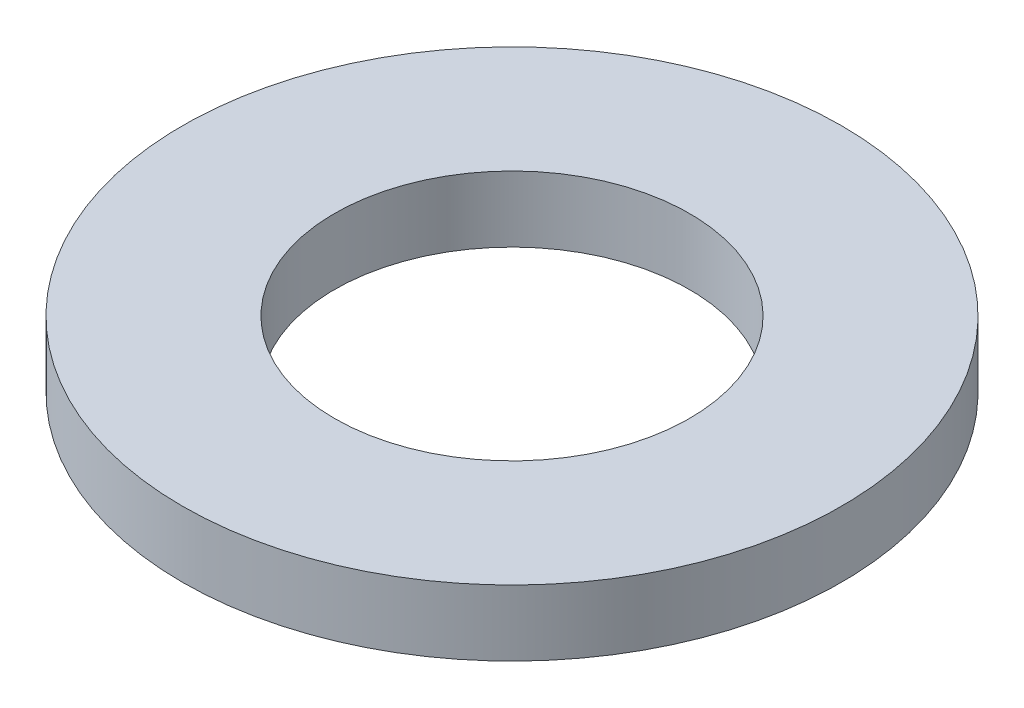
ISO-10303-21;
HEADER;
FILE_DESCRIPTION(('STEP AP214'),'2;1');
FILE_NAME('part.step','',(''),(''),'','','');
FILE_SCHEMA(('AUTOMOTIVE_DESIGN { 1 0 10303 214 1 1 1 1 }'));
ENDSEC;
DATA;
#1=APPLICATION_CONTEXT('core data for automotive mechanical design processes');
#2=APPLICATION_PROTOCOL_DEFINITION('international standard','automotive_design',2000,#1);
#3=PRODUCT_CONTEXT('',#1,'mechanical');
#4=PRODUCT('Part','Part','',(#3));
#5=PRODUCT_RELATED_PRODUCT_CATEGORY('part','',(#4));
#6=PRODUCT_DEFINITION_FORMATION('','',#4);
#7=PRODUCT_DEFINITION_CONTEXT('part definition',#1,'design');
#8=PRODUCT_DEFINITION('design','',#6,#7);
#9=PRODUCT_DEFINITION_SHAPE('','',#8);
#10=(LENGTH_UNIT() NAMED_UNIT(*) SI_UNIT(.MILLI.,.METRE.));
#11=(NAMED_UNIT(*) PLANE_ANGLE_UNIT() SI_UNIT($,.RADIAN.));
#12=(NAMED_UNIT(*) SI_UNIT($,.STERADIAN.) SOLID_ANGLE_UNIT());
#13=UNCERTAINTY_MEASURE_WITH_UNIT(LENGTH_MEASURE(1.E-05),#10,'distance_accuracy_value','');
#14=(GEOMETRIC_REPRESENTATION_CONTEXT(3) GLOBAL_UNCERTAINTY_ASSIGNED_CONTEXT((#13)) GLOBAL_UNIT_ASSIGNED_CONTEXT((#10,
#11,#12)) REPRESENTATION_CONTEXT('',''));
#15=CARTESIAN_POINT('',(0.,0.,0.));
#16=DIRECTION('',(0.,0.,1.));
#17=DIRECTION('',(1.,0.,0.));
#18=AXIS2_PLACEMENT_3D('',#15,#16,#17);
#19=CARTESIAN_POINT('',(0.,1.6,0.));
#20=DIRECTION('',(0.,1.,0.));
#21=DIRECTION('',(0.,0.,1.));
#22=AXIS2_PLACEMENT_3D('',#19,#20,#21);
#23=PLANE('',#22);
#24=CARTESIAN_POINT('',(0.,1.6,0.));
#25=DIRECTION('',(0.,1.,0.));
#26=DIRECTION('',(0.,0.,1.));
#27=AXIS2_PLACEMENT_3D('',#24,#25,#26);
#28=CIRCLE('',#27,8.);
#29=CARTESIAN_POINT('',(0.,1.6,8.));
#30=VERTEX_POINT('',#29);
#31=EDGE_CURVE('E10',#30,#30,#28,.T.);
#32=ORIENTED_EDGE('',*,*,#31,.T.);
#33=EDGE_LOOP('',(#32));
#34=FACE_BOUND('',#33,.T.);
#35=CARTESIAN_POINT('',(0.,1.6,0.));
#36=DIRECTION('',(0.,1.,0.));
#37=DIRECTION('',(0.,0.,1.));
#38=AXIS2_PLACEMENT_3D('',#35,#36,#37);
#39=CIRCLE('',#38,4.31);
#40=CARTESIAN_POINT('',(0.,1.6,4.31));
#41=VERTEX_POINT('',#40);
#42=EDGE_CURVE('E54',#41,#41,#39,.T.);
#43=ORIENTED_EDGE('',*,*,#42,.F.);
#44=EDGE_LOOP('',(#43));
#45=FACE_BOUND('',#44,.T.);
#46=ADVANCED_FACE('F40',(#34,#45),#23,.T.);
#47=CARTESIAN_POINT('',(0.,0.,0.));
#48=DIRECTION('',(0.,1.,0.));
#49=DIRECTION('',(0.,0.,1.));
#50=AXIS2_PLACEMENT_3D('',#47,#48,#49);
#51=PLANE('',#50);
#52=CARTESIAN_POINT('',(0.,0.,0.));
#53=DIRECTION('',(0.,1.,0.));
#54=DIRECTION('',(0.,0.,1.));
#55=AXIS2_PLACEMENT_3D('',#52,#53,#54);
#56=CIRCLE('',#55,8.);
#57=CARTESIAN_POINT('',(0.,0.,8.));
#58=VERTEX_POINT('',#57);
#59=EDGE_CURVE('E44',#58,#58,#56,.T.);
#60=ORIENTED_EDGE('',*,*,#59,.F.);
#61=EDGE_LOOP('',(#60));
#62=FACE_BOUND('',#61,.T.);
#63=CARTESIAN_POINT('',(0.,0.,0.));
#64=DIRECTION('',(0.,1.,0.));
#65=DIRECTION('',(0.,0.,1.));
#66=AXIS2_PLACEMENT_3D('',#63,#64,#65);
#67=CIRCLE('',#66,4.31);
#68=CARTESIAN_POINT('',(0.,0.,4.31));
#69=VERTEX_POINT('',#68);
#70=EDGE_CURVE('E56',#69,#69,#67,.T.);
#71=ORIENTED_EDGE('',*,*,#70,.T.);
#72=EDGE_LOOP('',(#71));
#73=FACE_BOUND('',#72,.T.);
#74=ADVANCED_FACE('F69',(#62,#73),#51,.F.);
#75=CARTESIAN_POINT('',(0.,1.6,0.));
#76=DIRECTION('',(0.,-1.,0.));
#77=DIRECTION('',(0.,0.,-1.));
#78=AXIS2_PLACEMENT_3D('',#75,#76,#77);
#79=CYLINDRICAL_SURFACE('',#78,8.);
#80=ORIENTED_EDGE('',*,*,#31,.F.);
#81=EDGE_LOOP('',(#80));
#82=FACE_BOUND('',#81,.T.);
#83=ORIENTED_EDGE('',*,*,#59,.T.);
#84=EDGE_LOOP('',(#83));
#85=FACE_BOUND('',#84,.T.);
#86=ADVANCED_FACE('F42',(#82,#85),#79,.T.);
#87=CARTESIAN_POINT('',(0.,1.6,0.));
#88=DIRECTION('',(0.,-1.,0.));
#89=DIRECTION('',(0.,0.,-1.));
#90=AXIS2_PLACEMENT_3D('',#87,#88,#89);
#91=CYLINDRICAL_SURFACE('',#90,4.31);
#92=ORIENTED_EDGE('',*,*,#42,.T.);
#93=EDGE_LOOP('',(#92));
#94=FACE_BOUND('',#93,.T.);
#95=ORIENTED_EDGE('',*,*,#70,.F.);
#96=EDGE_LOOP('',(#95));
#97=FACE_BOUND('',#96,.T.);
#98=ADVANCED_FACE('F65',(#94,#97),#91,.F.);
#99=CLOSED_SHELL('',(#46,#74,#86,#98));
#100=MANIFOLD_SOLID_BREP('B2',#99);
#101=ADVANCED_BREP_SHAPE_REPRESENTATION('',(#18,#100),#14);
#102=SHAPE_DEFINITION_REPRESENTATION(#9,#101);
ENDSEC;
END-ISO-10303-21;
